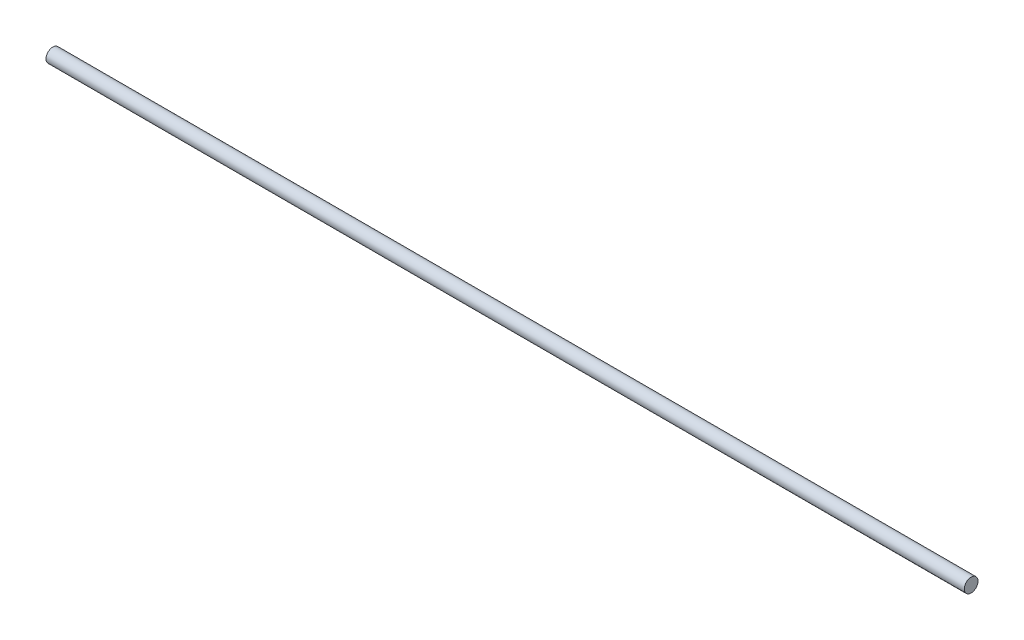
ISO-10303-21;
HEADER;
FILE_DESCRIPTION(('STEP AP214'),'2;1');
FILE_NAME('part.step','',(''),(''),'','','');
FILE_SCHEMA(('AUTOMOTIVE_DESIGN { 1 0 10303 214 1 1 1 1 }'));
ENDSEC;
DATA;
#1=APPLICATION_CONTEXT('core data for automotive mechanical design processes');
#2=APPLICATION_PROTOCOL_DEFINITION('international standard','automotive_design',2000,#1);
#3=PRODUCT_CONTEXT('',#1,'mechanical');
#4=PRODUCT('Part','Part','',(#3));
#5=PRODUCT_RELATED_PRODUCT_CATEGORY('part','',(#4));
#6=PRODUCT_DEFINITION_FORMATION('','',#4);
#7=PRODUCT_DEFINITION_CONTEXT('part definition',#1,'design');
#8=PRODUCT_DEFINITION('design','',#6,#7);
#9=PRODUCT_DEFINITION_SHAPE('','',#8);
#10=(LENGTH_UNIT() NAMED_UNIT(*) SI_UNIT(.MILLI.,.METRE.));
#11=(NAMED_UNIT(*) PLANE_ANGLE_UNIT() SI_UNIT($,.RADIAN.));
#12=(NAMED_UNIT(*) SI_UNIT($,.STERADIAN.) SOLID_ANGLE_UNIT());
#13=UNCERTAINTY_MEASURE_WITH_UNIT(LENGTH_MEASURE(1.E-05),#10,'distance_accuracy_value','');
#14=(GEOMETRIC_REPRESENTATION_CONTEXT(3) GLOBAL_UNCERTAINTY_ASSIGNED_CONTEXT((#13)) GLOBAL_UNIT_ASSIGNED_CONTEXT((#10,
#11,#12)) REPRESENTATION_CONTEXT('',''));
#15=CARTESIAN_POINT('',(0.,0.,0.));
#16=DIRECTION('',(0.,0.,1.));
#17=DIRECTION('',(1.,0.,0.));
#18=AXIS2_PLACEMENT_3D('',#15,#16,#17);
#19=CARTESIAN_POINT('',(0.,0.,0.));
#20=DIRECTION('',(-1.,0.,0.));
#21=DIRECTION('',(0.,0.,1.));
#22=AXIS2_PLACEMENT_3D('',#19,#20,#21);
#23=PLANE('',#22);
#24=CARTESIAN_POINT('',(0.,0.,0.));
#25=DIRECTION('',(-1.,0.,0.));
#26=DIRECTION('',(0.,0.,1.));
#27=AXIS2_PLACEMENT_3D('',#24,#25,#26);
#28=CIRCLE('',#27,1.5);
#29=CARTESIAN_POINT('',(0.,0.,1.5));
#30=VERTEX_POINT('',#29);
#31=EDGE_CURVE('E10',#30,#30,#28,.T.);
#32=ORIENTED_EDGE('',*,*,#31,.F.);
#33=EDGE_LOOP('',(#32));
#34=FACE_BOUND('',#33,.T.);
#35=ADVANCED_FACE('F39',(#34),#23,.F.);
#36=CARTESIAN_POINT('',(-190.,0.,0.));
#37=DIRECTION('',(-1.,0.,0.));
#38=DIRECTION('',(0.,0.,1.));
#39=AXIS2_PLACEMENT_3D('',#36,#37,#38);
#40=CYLINDRICAL_SURFACE('',#39,1.49999999999999);
#41=CARTESIAN_POINT('',(-200.,0.,0.));
#42=DIRECTION('',(-1.,0.,0.));
#43=DIRECTION('',(0.,0.,1.));
#44=AXIS2_PLACEMENT_3D('',#41,#42,#43);
#45=CIRCLE('',#44,1.49999999999998);
#46=CARTESIAN_POINT('',(-200.,0.,1.49999999999998));
#47=VERTEX_POINT('',#46);
#48=EDGE_CURVE('E45',#47,#47,#45,.T.);
#49=ORIENTED_EDGE('',*,*,#48,.F.);
#50=EDGE_LOOP('',(#49));
#51=FACE_BOUND('',#50,.T.);
#52=ORIENTED_EDGE('',*,*,#31,.T.);
#53=EDGE_LOOP('',(#52));
#54=FACE_BOUND('',#53,.T.);
#55=ADVANCED_FACE('F69',(#51,#54),#40,.T.);
#56=CARTESIAN_POINT('',(-200.,1.49999999999998,0.));
#57=DIRECTION('',(1.,0.,0.));
#58=DIRECTION('',(0.,0.,-1.));
#59=AXIS2_PLACEMENT_3D('',#56,#57,#58);
#60=PLANE('',#59);
#61=CARTESIAN_POINT('',(-200.,0.,0.));
#62=DIRECTION('',(-1.,0.,0.));
#63=DIRECTION('',(0.,0.,1.));
#64=AXIS2_PLACEMENT_3D('',#61,#62,#63);
#65=CIRCLE('',#64,0.749999999999999);
#66=CARTESIAN_POINT('',(-200.,0.,0.749999999999999));
#67=VERTEX_POINT('',#66);
#68=EDGE_CURVE('E49',#67,#67,#65,.T.);
#69=ORIENTED_EDGE('',*,*,#68,.F.);
#70=EDGE_LOOP('',(#69));
#71=FACE_BOUND('',#70,.T.);
#72=ORIENTED_EDGE('',*,*,#48,.T.);
#73=EDGE_LOOP('',(#72));
#74=FACE_BOUND('',#73,.T.);
#75=ADVANCED_FACE('F64',(#71,#74),#60,.F.);
#76=CARTESIAN_POINT('',(-190.,0.,0.));
#77=DIRECTION('',(-1.,0.,0.));
#78=DIRECTION('',(0.,0.,1.));
#79=AXIS2_PLACEMENT_3D('',#76,#77,#78);
#80=CYLINDRICAL_SURFACE('',#79,0.749999999999999);
#81=CARTESIAN_POINT('',(-190.,0.,0.));
#82=DIRECTION('',(-1.,0.,0.));
#83=DIRECTION('',(0.,0.,1.));
#84=AXIS2_PLACEMENT_3D('',#81,#82,#83);
#85=CIRCLE('',#84,0.75);
#86=CARTESIAN_POINT('',(-190.,0.,0.75));
#87=VERTEX_POINT('',#86);
#88=EDGE_CURVE('E53',#87,#87,#85,.T.);
#89=ORIENTED_EDGE('',*,*,#88,.F.);
#90=EDGE_LOOP('',(#89));
#91=FACE_BOUND('',#90,.T.);
#92=ORIENTED_EDGE('',*,*,#68,.T.);
#93=EDGE_LOOP('',(#92));
#94=FACE_BOUND('',#93,.T.);
#95=ADVANCED_FACE('F61',(#91,#94),#80,.F.);
#96=CARTESIAN_POINT('',(-190.,0.,0.));
#97=DIRECTION('',(1.,0.,0.));
#98=DIRECTION('',(0.,0.,-1.));
#99=AXIS2_PLACEMENT_3D('',#96,#97,#98);
#100=PLANE('',#99);
#101=ORIENTED_EDGE('',*,*,#88,.T.);
#102=EDGE_LOOP('',(#101));
#103=FACE_BOUND('',#102,.T.);
#104=ADVANCED_FACE('F59',(#103),#100,.F.);
#105=CLOSED_SHELL('',(#35,#55,#75,#95,#104));
#106=MANIFOLD_SOLID_BREP('B2',#105);
#107=ADVANCED_BREP_SHAPE_REPRESENTATION('',(#18,#106),#14);
#108=SHAPE_DEFINITION_REPRESENTATION(#9,#107);
ENDSEC;
END-ISO-10303-21;
